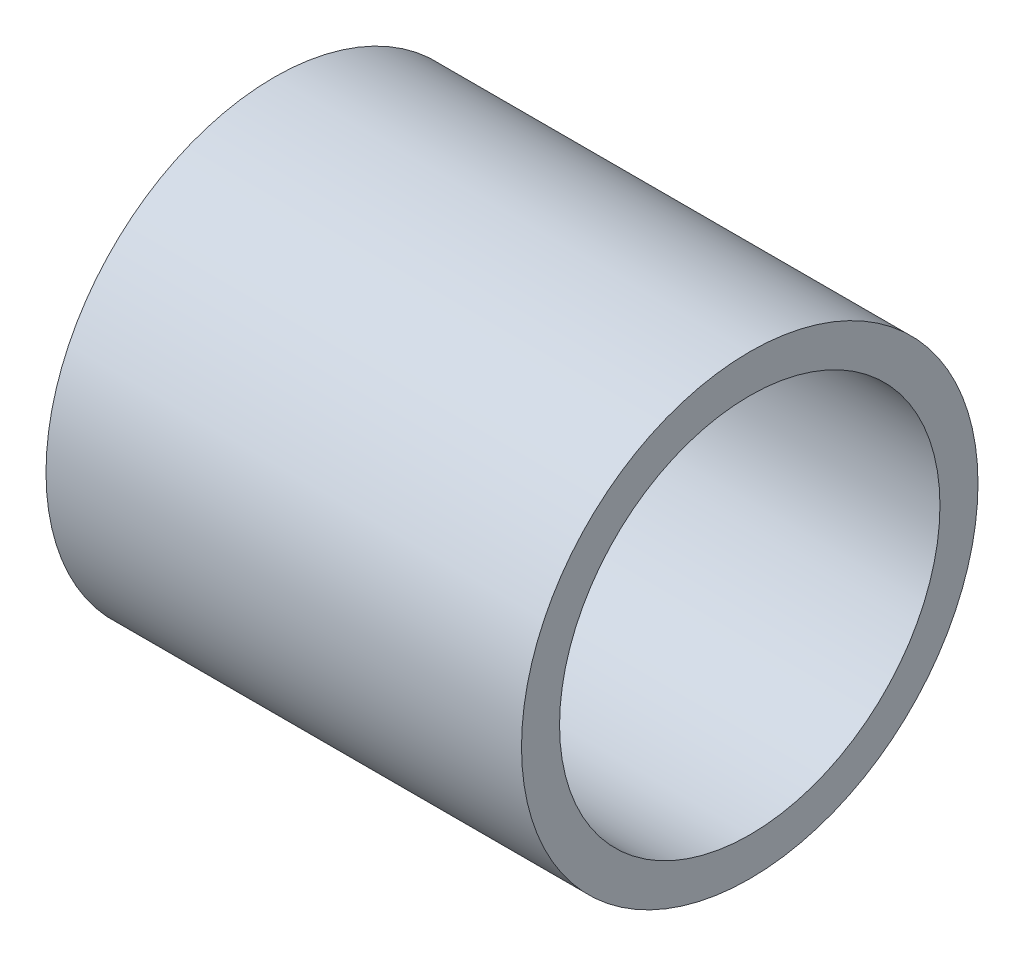
ISO-10303-21;
HEADER;
FILE_DESCRIPTION(('STEP AP214'),'2;1');
FILE_NAME('part.step','',(''),(''),'','','');
FILE_SCHEMA(('AUTOMOTIVE_DESIGN { 1 0 10303 214 1 1 1 1 }'));
ENDSEC;
DATA;
#1=APPLICATION_CONTEXT('core data for automotive mechanical design processes');
#2=APPLICATION_PROTOCOL_DEFINITION('international standard','automotive_design',2000,#1);
#3=PRODUCT_CONTEXT('',#1,'mechanical');
#4=PRODUCT('Part','Part','',(#3));
#5=PRODUCT_RELATED_PRODUCT_CATEGORY('part','',(#4));
#6=PRODUCT_DEFINITION_FORMATION('','',#4);
#7=PRODUCT_DEFINITION_CONTEXT('part definition',#1,'design');
#8=PRODUCT_DEFINITION('design','',#6,#7);
#9=PRODUCT_DEFINITION_SHAPE('','',#8);
#10=(LENGTH_UNIT() NAMED_UNIT(*) SI_UNIT(.MILLI.,.METRE.));
#11=(NAMED_UNIT(*) PLANE_ANGLE_UNIT() SI_UNIT($,.RADIAN.));
#12=(NAMED_UNIT(*) SI_UNIT($,.STERADIAN.) SOLID_ANGLE_UNIT());
#13=UNCERTAINTY_MEASURE_WITH_UNIT(LENGTH_MEASURE(1.E-05),#10,'distance_accuracy_value','');
#14=(GEOMETRIC_REPRESENTATION_CONTEXT(3) GLOBAL_UNCERTAINTY_ASSIGNED_CONTEXT((#13)) GLOBAL_UNIT_ASSIGNED_CONTEXT((#10,
#11,#12)) REPRESENTATION_CONTEXT('',''));
#15=CARTESIAN_POINT('',(0.,0.,0.));
#16=DIRECTION('',(0.,0.,1.));
#17=DIRECTION('',(1.,0.,0.));
#18=AXIS2_PLACEMENT_3D('',#15,#16,#17);
#19=CARTESIAN_POINT('',(0.,0.,0.));
#20=DIRECTION('',(1.,0.,0.));
#21=DIRECTION('',(0.,0.,-1.));
#22=AXIS2_PLACEMENT_3D('',#19,#20,#21);
#23=PLANE('',#22);
#24=CARTESIAN_POINT('',(0.,0.,0.));
#25=DIRECTION('',(-1.,0.,0.));
#26=DIRECTION('',(0.,0.,1.));
#27=AXIS2_PLACEMENT_3D('',#24,#25,#26);
#28=CIRCLE('',#27,5.);
#29=CARTESIAN_POINT('',(0.,0.,5.));
#30=VERTEX_POINT('',#29);
#31=EDGE_CURVE('E36',#30,#30,#28,.F.);
#32=ORIENTED_EDGE('',*,*,#31,.T.);
#33=EDGE_LOOP('',(#32));
#34=FACE_BOUND('',#33,.T.);
#35=ADVANCED_FACE('F15',(#34),#23,.T.);
#36=CARTESIAN_POINT('',(0.,0.,0.));
#37=DIRECTION('',(-1.,0.,0.));
#38=DIRECTION('',(0.,0.,1.));
#39=AXIS2_PLACEMENT_3D('',#36,#37,#38);
#40=CYLINDRICAL_SURFACE('',#39,5.);
#41=ORIENTED_EDGE('',*,*,#31,.F.);
#42=EDGE_LOOP('',(#41));
#43=FACE_BOUND('',#42,.T.);
#44=CARTESIAN_POINT('',(11.,0.,0.));
#45=DIRECTION('',(-1.,0.,0.));
#46=DIRECTION('',(0.,0.,1.));
#47=AXIS2_PLACEMENT_3D('',#44,#45,#46);
#48=CIRCLE('',#47,5.);
#49=CARTESIAN_POINT('',(11.,0.,5.));
#50=VERTEX_POINT('',#49);
#51=EDGE_CURVE('E27',#50,#50,#48,.T.);
#52=ORIENTED_EDGE('',*,*,#51,.F.);
#53=EDGE_LOOP('',(#52));
#54=FACE_BOUND('',#53,.T.);
#55=ADVANCED_FACE('F42',(#43,#54),#40,.F.);
#56=CARTESIAN_POINT('',(11.,0.,0.));
#57=DIRECTION('',(1.,0.,0.));
#58=DIRECTION('',(0.,0.,-1.));
#59=AXIS2_PLACEMENT_3D('',#56,#57,#58);
#60=PLANE('',#59);
#61=ORIENTED_EDGE('',*,*,#51,.T.);
#62=EDGE_LOOP('',(#61));
#63=FACE_BOUND('',#62,.T.);
#64=CARTESIAN_POINT('',(11.,0.,0.));
#65=DIRECTION('',(1.,0.,0.));
#66=DIRECTION('',(0.,0.,-1.));
#67=AXIS2_PLACEMENT_3D('',#64,#65,#66);
#68=CIRCLE('',#67,6.);
#69=CARTESIAN_POINT('',(11.,0.,-6.));
#70=VERTEX_POINT('',#69);
#71=EDGE_CURVE('E22',#70,#70,#68,.F.);
#72=ORIENTED_EDGE('',*,*,#71,.F.);
#73=EDGE_LOOP('',(#72));
#74=FACE_BOUND('',#73,.T.);
#75=ADVANCED_FACE('F45',(#63,#74),#60,.T.);
#76=CARTESIAN_POINT('',(34.2499999999998,0.,-4.71925298093923E-13));
#77=DIRECTION('',(0.,0.,1.));
#78=DIRECTION('',(0.,1.,0.));
#79=AXIS2_PLACEMENT_3D('',#76,#77,#78);
#80=SPHERICAL_SURFACE('',#79,36.2499999999998);
#81=CARTESIAN_POINT('',(-1.5,0.,0.));
#82=DIRECTION('',(1.,0.,0.));
#83=DIRECTION('',(0.,0.,-1.));
#84=AXIS2_PLACEMENT_3D('',#81,#82,#83);
#85=CIRCLE('',#84,6.);
#86=CARTESIAN_POINT('',(-1.5,0.,-6.));
#87=VERTEX_POINT('',#86);
#88=EDGE_CURVE('E10',#87,#87,#85,.T.);
#89=ORIENTED_EDGE('',*,*,#88,.F.);
#90=EDGE_LOOP('',(#89));
#91=FACE_BOUND('',#90,.T.);
#92=ADVANCED_FACE('F50',(#91),#80,.T.);
#93=CARTESIAN_POINT('',(0.,0.,0.));
#94=DIRECTION('',(1.,0.,0.));
#95=DIRECTION('',(0.,0.,-1.));
#96=AXIS2_PLACEMENT_3D('',#93,#94,#95);
#97=CYLINDRICAL_SURFACE('',#96,6.);
#98=ORIENTED_EDGE('',*,*,#88,.T.);
#99=EDGE_LOOP('',(#98));
#100=FACE_BOUND('',#99,.T.);
#101=ORIENTED_EDGE('',*,*,#71,.T.);
#102=EDGE_LOOP('',(#101));
#103=FACE_BOUND('',#102,.T.);
#104=ADVANCED_FACE('F54',(#100,#103),#97,.T.);
#105=CLOSED_SHELL('',(#35,#55,#75,#92,#104));
#106=MANIFOLD_SOLID_BREP('B1',#105);
#107=ADVANCED_BREP_SHAPE_REPRESENTATION('',(#18,#106),#14);
#108=SHAPE_DEFINITION_REPRESENTATION(#9,#107);
ENDSEC;
END-ISO-10303-21;
